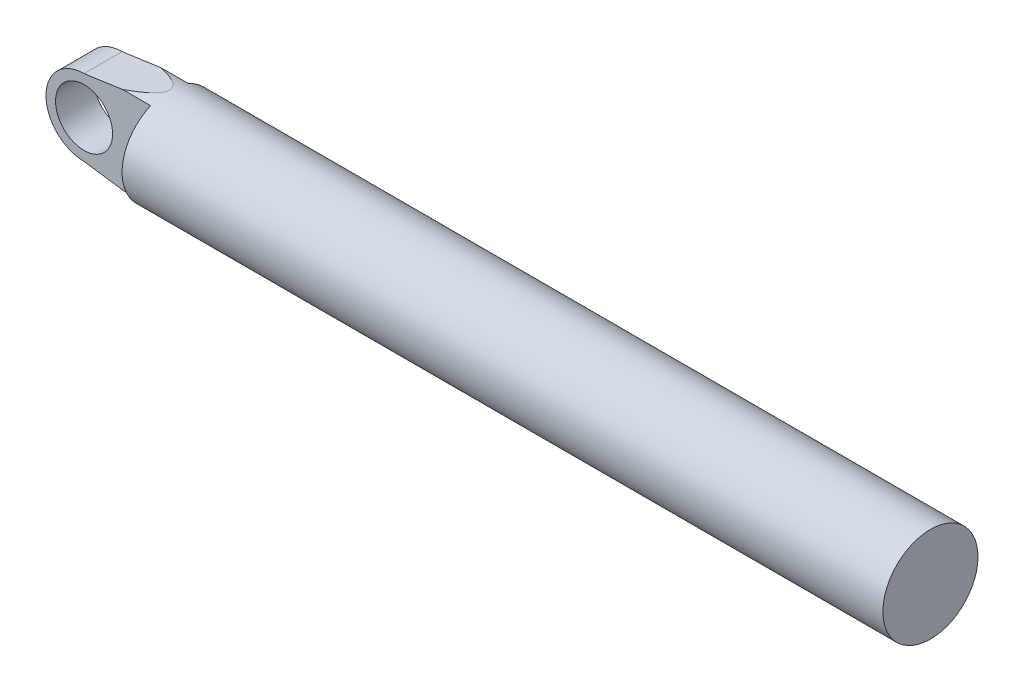
ISO-10303-21;
HEADER;
FILE_DESCRIPTION(('STEP AP214'),'2;1');
FILE_NAME('part.step','',(''),(''),'','','');
FILE_SCHEMA(('AUTOMOTIVE_DESIGN { 1 0 10303 214 1 1 1 1 }'));
ENDSEC;
DATA;
#1=APPLICATION_CONTEXT('core data for automotive mechanical design processes');
#2=APPLICATION_PROTOCOL_DEFINITION('international standard','automotive_design',2000,#1);
#3=PRODUCT_CONTEXT('',#1,'mechanical');
#4=PRODUCT('Part','Part','',(#3));
#5=PRODUCT_RELATED_PRODUCT_CATEGORY('part','',(#4));
#6=PRODUCT_DEFINITION_FORMATION('','',#4);
#7=PRODUCT_DEFINITION_CONTEXT('part definition',#1,'design');
#8=PRODUCT_DEFINITION('design','',#6,#7);
#9=PRODUCT_DEFINITION_SHAPE('','',#8);
#10=(LENGTH_UNIT() NAMED_UNIT(*) SI_UNIT(.MILLI.,.METRE.));
#11=(NAMED_UNIT(*) PLANE_ANGLE_UNIT() SI_UNIT($,.RADIAN.));
#12=(NAMED_UNIT(*) SI_UNIT($,.STERADIAN.) SOLID_ANGLE_UNIT());
#13=UNCERTAINTY_MEASURE_WITH_UNIT(LENGTH_MEASURE(1.E-05),#10,'distance_accuracy_value','');
#14=(GEOMETRIC_REPRESENTATION_CONTEXT(3) GLOBAL_UNCERTAINTY_ASSIGNED_CONTEXT((#13)) GLOBAL_UNIT_ASSIGNED_CONTEXT((#10,
#11,#12)) REPRESENTATION_CONTEXT('',''));
#15=CARTESIAN_POINT('',(0.,0.,0.));
#16=DIRECTION('',(0.,0.,1.));
#17=DIRECTION('',(1.,0.,0.));
#18=AXIS2_PLACEMENT_3D('',#15,#16,#17);
#19=CARTESIAN_POINT('',(0.,25.,-10.));
#20=DIRECTION('',(-0.14142135623731,0.989949493661166,0.));
#21=DIRECTION('',(-0.989949493661167,-0.14142135623731,0.));
#22=AXIS2_PLACEMENT_3D('',#19,#20,#21);
#23=PLANE('',#22);
#24=DIRECTION('',(-0.989949493661166,-0.14142135623731,0.));
#25=VECTOR('',#24,1.);
#26=CARTESIAN_POINT('',(0.,25.,10.));
#27=LINE('',#26,#25);
#28=CARTESIAN_POINT('',(-14.6098506765454,22.9128784747792,10.));
#29=VERTEX_POINT('',#28);
#30=CARTESIAN_POINT('',(-35.,20.,10.));
#31=VERTEX_POINT('',#30);
#32=EDGE_CURVE('E132',#29,#31,#27,.T.);
#33=ORIENTED_EDGE('',*,*,#32,.F.);
#34=CARTESIAN_POINT('',(-175.,0.,0.));
#35=DIRECTION('',(-0.14142135623731,0.989949493661166,0.));
#36=DIRECTION('',(0.989949493661167,0.14142135623731,0.));
#37=AXIS2_PLACEMENT_3D('',#34,#35,#36);
#38=ELLIPSE('',#37,176.776695296637,25.);
#39=CARTESIAN_POINT('',(-14.6098506765454,22.9128784747792,-10.));
#40=VERTEX_POINT('',#39);
#41=EDGE_CURVE('E48',#29,#40,#38,.T.);
#42=ORIENTED_EDGE('',*,*,#41,.T.);
#43=DIRECTION('',(-0.989949493661166,-0.14142135623731,0.));
#44=VECTOR('',#43,1.);
#45=CARTESIAN_POINT('',(0.,25.,-10.));
#46=LINE('',#45,#44);
#47=CARTESIAN_POINT('',(-35.,20.,-10.));
#48=VERTEX_POINT('',#47);
#49=EDGE_CURVE('E93',#40,#48,#46,.T.);
#50=ORIENTED_EDGE('',*,*,#49,.T.);
#51=DIRECTION('',(0.,0.,1.));
#52=VECTOR('',#51,1.);
#53=CARTESIAN_POINT('',(-35.,20.,-10.));
#54=LINE('',#53,#52);
#55=EDGE_CURVE('E108',#48,#31,#54,.T.);
#56=ORIENTED_EDGE('',*,*,#55,.T.);
#57=EDGE_LOOP('',(#33,#42,#50,#56));
#58=FACE_BOUND('',#57,.T.);
#59=ADVANCED_FACE('F33',(#58),#23,.T.);
#60=CARTESIAN_POINT('',(-35.,-20.,-10.));
#61=DIRECTION('',(-0.14142135623731,-0.989949493661166,0.));
#62=DIRECTION('',(0.989949493661167,-0.14142135623731,0.));
#63=AXIS2_PLACEMENT_3D('',#60,#61,#62);
#64=PLANE('',#63);
#65=CARTESIAN_POINT('',(-175.,0.,0.));
#66=DIRECTION('',(-0.14142135623731,-0.989949493661166,0.));
#67=DIRECTION('',(0.989949493661167,-0.14142135623731,0.));
#68=AXIS2_PLACEMENT_3D('',#65,#66,#67);
#69=ELLIPSE('',#68,176.776695296637,25.);
#70=CARTESIAN_POINT('',(-14.6098506765455,-22.9128784747792,-10.));
#71=VERTEX_POINT('',#70);
#72=CARTESIAN_POINT('',(-14.6098506765455,-22.9128784747792,10.));
#73=VERTEX_POINT('',#72);
#74=EDGE_CURVE('E95',#71,#73,#69,.T.);
#75=ORIENTED_EDGE('',*,*,#74,.T.);
#76=DIRECTION('',(0.989949493661166,-0.14142135623731,0.));
#77=VECTOR('',#76,1.);
#78=CARTESIAN_POINT('',(-35.,-20.,10.));
#79=LINE('',#78,#77);
#80=CARTESIAN_POINT('',(-35.,-20.,10.));
#81=VERTEX_POINT('',#80);
#82=EDGE_CURVE('E117',#81,#73,#79,.T.);
#83=ORIENTED_EDGE('',*,*,#82,.F.);
#84=DIRECTION('',(0.,0.,1.));
#85=VECTOR('',#84,1.);
#86=CARTESIAN_POINT('',(-35.,-20.,-10.));
#87=LINE('',#86,#85);
#88=CARTESIAN_POINT('',(-35.,-20.,-10.));
#89=VERTEX_POINT('',#88);
#90=EDGE_CURVE('E105',#89,#81,#87,.T.);
#91=ORIENTED_EDGE('',*,*,#90,.F.);
#92=DIRECTION('',(0.989949493661166,-0.14142135623731,0.));
#93=VECTOR('',#92,1.);
#94=CARTESIAN_POINT('',(-35.,-20.,-10.));
#95=LINE('',#94,#93);
#96=EDGE_CURVE('E126',#89,#71,#95,.T.);
#97=ORIENTED_EDGE('',*,*,#96,.T.);
#98=EDGE_LOOP('',(#75,#83,#91,#97));
#99=FACE_BOUND('',#98,.T.);
#100=ADVANCED_FACE('F146',(#99),#64,.T.);
#101=CARTESIAN_POINT('',(-35.,0.,-10.));
#102=DIRECTION('',(0.,0.,1.));
#103=DIRECTION('',(1.,0.,0.));
#104=AXIS2_PLACEMENT_3D('',#101,#102,#103);
#105=PLANE('',#104);
#106=CARTESIAN_POINT('',(-35.,0.,-10.));
#107=DIRECTION('',(0.,0.,1.));
#108=DIRECTION('',(1.,0.,0.));
#109=AXIS2_PLACEMENT_3D('',#106,#107,#108);
#110=CIRCLE('',#109,15.);
#111=CARTESIAN_POINT('',(-20.,0.,-10.));
#112=VERTEX_POINT('',#111);
#113=EDGE_CURVE('E119',#112,#112,#110,.T.);
#114=ORIENTED_EDGE('',*,*,#113,.T.);
#115=EDGE_LOOP('',(#114));
#116=FACE_BOUND('',#115,.T.);
#117=DIRECTION('',(1.,0.,0.));
#118=VECTOR('',#117,1.);
#119=CARTESIAN_POINT('',(-70.,-22.9128784747792,-10.));
#120=LINE('',#119,#118);
#121=CARTESIAN_POINT('',(0.,-22.9128784747792,-10.));
#122=VERTEX_POINT('',#121);
#123=EDGE_CURVE('E103',#71,#122,#120,.T.);
#124=ORIENTED_EDGE('',*,*,#123,.F.);
#125=ORIENTED_EDGE('',*,*,#96,.F.);
#126=CARTESIAN_POINT('',(-35.,0.,-10.));
#127=DIRECTION('',(0.,0.,1.));
#128=DIRECTION('',(1.,0.,0.));
#129=AXIS2_PLACEMENT_3D('',#126,#127,#128);
#130=CIRCLE('',#129,20.);
#131=EDGE_CURVE('E123',#48,#89,#130,.T.);
#132=ORIENTED_EDGE('',*,*,#131,.F.);
#133=ORIENTED_EDGE('',*,*,#49,.F.);
#134=DIRECTION('',(1.,0.,0.));
#135=VECTOR('',#134,1.);
#136=CARTESIAN_POINT('',(-70.,22.9128784747792,-10.));
#137=LINE('',#136,#135);
#138=CARTESIAN_POINT('',(0.,22.9128784747792,-10.));
#139=VERTEX_POINT('',#138);
#140=EDGE_CURVE('E86',#139,#40,#137,.F.);
#141=ORIENTED_EDGE('',*,*,#140,.F.);
#142=DIRECTION('',(0.,1.,0.));
#143=VECTOR('',#142,1.);
#144=CARTESIAN_POINT('',(0.,25.,-10.));
#145=LINE('',#144,#143);
#146=EDGE_CURVE('E90',#122,#139,#145,.T.);
#147=ORIENTED_EDGE('',*,*,#146,.F.);
#148=EDGE_LOOP('',(#124,#125,#132,#133,#141,#147));
#149=FACE_BOUND('',#148,.T.);
#150=ADVANCED_FACE('F89',(#116,#149),#105,.F.);
#151=CARTESIAN_POINT('',(-35.,0.,10.));
#152=DIRECTION('',(0.,0.,1.));
#153=DIRECTION('',(1.,0.,0.));
#154=AXIS2_PLACEMENT_3D('',#151,#152,#153);
#155=PLANE('',#154);
#156=CARTESIAN_POINT('',(-35.,0.,10.));
#157=DIRECTION('',(0.,0.,1.));
#158=DIRECTION('',(1.,0.,0.));
#159=AXIS2_PLACEMENT_3D('',#156,#157,#158);
#160=CIRCLE('',#159,15.);
#161=CARTESIAN_POINT('',(-20.,0.,10.));
#162=VERTEX_POINT('',#161);
#163=EDGE_CURVE('E138',#162,#162,#160,.T.);
#164=ORIENTED_EDGE('',*,*,#163,.F.);
#165=EDGE_LOOP('',(#164));
#166=FACE_BOUND('',#165,.T.);
#167=ORIENTED_EDGE('',*,*,#82,.T.);
#168=DIRECTION('',(1.,0.,0.));
#169=VECTOR('',#168,1.);
#170=CARTESIAN_POINT('',(-70.,-22.9128784747792,10.));
#171=LINE('',#170,#169);
#172=CARTESIAN_POINT('',(0.,-22.9128784747792,10.));
#173=VERTEX_POINT('',#172);
#174=EDGE_CURVE('E11',#73,#173,#171,.T.);
#175=ORIENTED_EDGE('',*,*,#174,.T.);
#176=DIRECTION('',(0.,1.,0.));
#177=VECTOR('',#176,1.);
#178=CARTESIAN_POINT('',(0.,25.,10.));
#179=LINE('',#178,#177);
#180=CARTESIAN_POINT('',(0.,22.9128784747792,10.));
#181=VERTEX_POINT('',#180);
#182=EDGE_CURVE('E100',#173,#181,#179,.T.);
#183=ORIENTED_EDGE('',*,*,#182,.T.);
#184=DIRECTION('',(1.,0.,0.));
#185=VECTOR('',#184,1.);
#186=CARTESIAN_POINT('',(-70.,22.9128784747792,10.));
#187=LINE('',#186,#185);
#188=EDGE_CURVE('E41',#181,#29,#187,.F.);
#189=ORIENTED_EDGE('',*,*,#188,.T.);
#190=ORIENTED_EDGE('',*,*,#32,.T.);
#191=CARTESIAN_POINT('',(-35.,0.,10.));
#192=DIRECTION('',(0.,0.,1.));
#193=DIRECTION('',(1.,0.,0.));
#194=AXIS2_PLACEMENT_3D('',#191,#192,#193);
#195=CIRCLE('',#194,20.);
#196=EDGE_CURVE('E135',#31,#81,#195,.T.);
#197=ORIENTED_EDGE('',*,*,#196,.T.);
#198=EDGE_LOOP('',(#167,#175,#183,#189,#190,#197));
#199=FACE_BOUND('',#198,.T.);
#200=ADVANCED_FACE('F148',(#166,#199),#155,.T.);
#201=CARTESIAN_POINT('',(0.,0.,0.));
#202=DIRECTION('',(1.,0.,0.));
#203=DIRECTION('',(0.,0.,-1.));
#204=AXIS2_PLACEMENT_3D('',#201,#202,#203);
#205=PLANE('',#204);
#206=ORIENTED_EDGE('',*,*,#182,.F.);
#207=CARTESIAN_POINT('',(0.,0.,0.));
#208=DIRECTION('',(1.,0.,0.));
#209=DIRECTION('',(0.,0.,-1.));
#210=AXIS2_PLACEMENT_3D('',#207,#208,#209);
#211=CIRCLE('',#210,25.);
#212=EDGE_CURVE('E104',#181,#173,#211,.T.);
#213=ORIENTED_EDGE('',*,*,#212,.F.);
#214=EDGE_LOOP('',(#206,#213));
#215=FACE_BOUND('',#214,.T.);
#216=ADVANCED_FACE('F150',(#215),#205,.F.);
#217=CARTESIAN_POINT('',(400.,0.,0.));
#218=DIRECTION('',(-1.,0.,0.));
#219=DIRECTION('',(0.,0.,1.));
#220=AXIS2_PLACEMENT_3D('',#217,#218,#219);
#221=CYLINDRICAL_SURFACE('',#220,25.);
#222=CARTESIAN_POINT('',(400.,0.,0.));
#223=DIRECTION('',(1.,0.,0.));
#224=DIRECTION('',(0.,0.,-1.));
#225=AXIS2_PLACEMENT_3D('',#222,#223,#224);
#226=CIRCLE('',#225,25.);
#227=CARTESIAN_POINT('',(400.,0.,-25.));
#228=VERTEX_POINT('',#227);
#229=EDGE_CURVE('E101',#228,#228,#226,.T.);
#230=ORIENTED_EDGE('',*,*,#229,.F.);
#231=EDGE_LOOP('',(#230));
#232=FACE_BOUND('',#231,.T.);
#233=EDGE_CURVE('E99',#122,#139,#211,.T.);
#234=ORIENTED_EDGE('',*,*,#233,.T.);
#235=ORIENTED_EDGE('',*,*,#140,.T.);
#236=ORIENTED_EDGE('',*,*,#41,.F.);
#237=ORIENTED_EDGE('',*,*,#188,.F.);
#238=ORIENTED_EDGE('',*,*,#212,.T.);
#239=ORIENTED_EDGE('',*,*,#174,.F.);
#240=ORIENTED_EDGE('',*,*,#74,.F.);
#241=ORIENTED_EDGE('',*,*,#123,.T.);
#242=EDGE_LOOP('',(#234,#235,#236,#237,#238,#239,#240,#241));
#243=FACE_BOUND('',#242,.T.);
#244=ADVANCED_FACE('F35',(#232,#243),#221,.T.);
#245=CARTESIAN_POINT('',(400.,0.,0.));
#246=DIRECTION('',(1.,0.,0.));
#247=DIRECTION('',(0.,0.,-1.));
#248=AXIS2_PLACEMENT_3D('',#245,#246,#247);
#249=PLANE('',#248);
#250=ORIENTED_EDGE('',*,*,#229,.T.);
#251=EDGE_LOOP('',(#250));
#252=FACE_BOUND('',#251,.T.);
#253=ADVANCED_FACE('F170',(#252),#249,.T.);
#254=ORIENTED_EDGE('',*,*,#233,.F.);
#255=ORIENTED_EDGE('',*,*,#146,.T.);
#256=EDGE_LOOP('',(#254,#255));
#257=FACE_BOUND('',#256,.T.);
#258=ADVANCED_FACE('F98',(#257),#205,.F.);
#259=CARTESIAN_POINT('',(-35.,0.,-10.));
#260=DIRECTION('',(0.,0.,1.));
#261=DIRECTION('',(1.,0.,0.));
#262=AXIS2_PLACEMENT_3D('',#259,#260,#261);
#263=CYLINDRICAL_SURFACE('',#262,20.);
#264=ORIENTED_EDGE('',*,*,#90,.T.);
#265=ORIENTED_EDGE('',*,*,#196,.F.);
#266=ORIENTED_EDGE('',*,*,#55,.F.);
#267=ORIENTED_EDGE('',*,*,#131,.T.);
#268=EDGE_LOOP('',(#264,#265,#266,#267));
#269=FACE_BOUND('',#268,.T.);
#270=ADVANCED_FACE('F136',(#269),#263,.T.);
#271=CARTESIAN_POINT('',(-35.,0.,-10.));
#272=DIRECTION('',(0.,0.,1.));
#273=DIRECTION('',(1.,0.,0.));
#274=AXIS2_PLACEMENT_3D('',#271,#272,#273);
#275=CYLINDRICAL_SURFACE('',#274,15.);
#276=ORIENTED_EDGE('',*,*,#113,.F.);
#277=EDGE_LOOP('',(#276));
#278=FACE_BOUND('',#277,.T.);
#279=ORIENTED_EDGE('',*,*,#163,.T.);
#280=EDGE_LOOP('',(#279));
#281=FACE_BOUND('',#280,.T.);
#282=ADVANCED_FACE('F177',(#278,#281),#275,.F.);
#283=CLOSED_SHELL('',(#59,#100,#150,#200,#216,#244,#253,#258,#270,#282));
#284=MANIFOLD_SOLID_BREP('B2',#283);
#285=ADVANCED_BREP_SHAPE_REPRESENTATION('',(#18,#284),#14);
#286=SHAPE_DEFINITION_REPRESENTATION(#9,#285);
ENDSEC;
END-ISO-10303-21;
